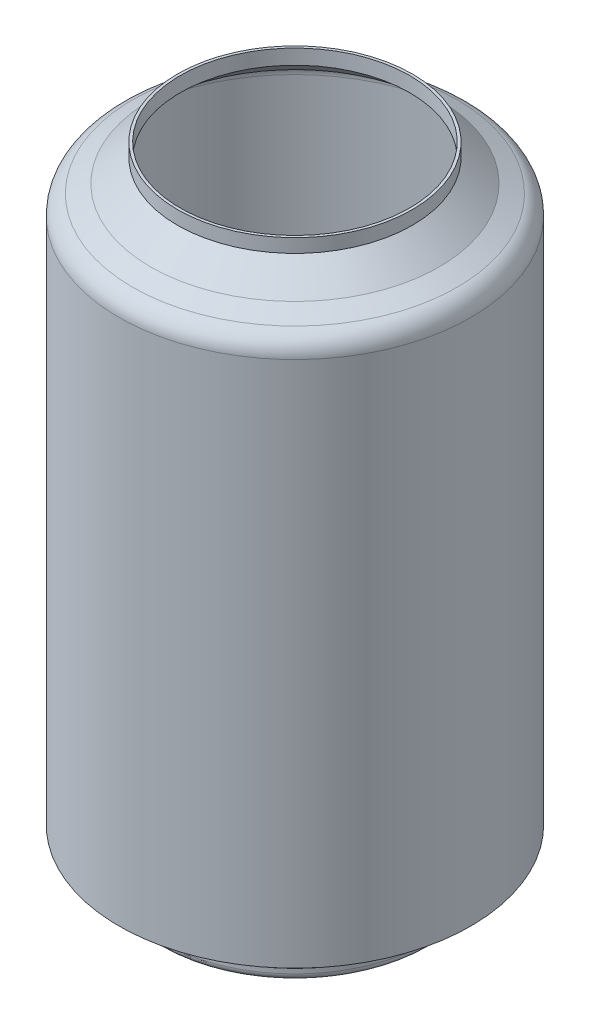
ISO-10303-21;
HEADER;
FILE_DESCRIPTION(('STEP AP214'),'2;1');
FILE_NAME('part.step','',(''),(''),'','','');
FILE_SCHEMA(('AUTOMOTIVE_DESIGN { 1 0 10303 214 1 1 1 1 }'));
ENDSEC;
DATA;
#1=APPLICATION_CONTEXT('core data for automotive mechanical design processes');
#2=APPLICATION_PROTOCOL_DEFINITION('international standard','automotive_design',2000,#1);
#3=PRODUCT_CONTEXT('',#1,'mechanical');
#4=PRODUCT('Part','Part','',(#3));
#5=PRODUCT_RELATED_PRODUCT_CATEGORY('part','',(#4));
#6=PRODUCT_DEFINITION_FORMATION('','',#4);
#7=PRODUCT_DEFINITION_CONTEXT('part definition',#1,'design');
#8=PRODUCT_DEFINITION('design','',#6,#7);
#9=PRODUCT_DEFINITION_SHAPE('','',#8);
#10=(LENGTH_UNIT() NAMED_UNIT(*) SI_UNIT(.MILLI.,.METRE.));
#11=(NAMED_UNIT(*) PLANE_ANGLE_UNIT() SI_UNIT($,.RADIAN.));
#12=(NAMED_UNIT(*) SI_UNIT($,.STERADIAN.) SOLID_ANGLE_UNIT());
#13=UNCERTAINTY_MEASURE_WITH_UNIT(LENGTH_MEASURE(1.E-05),#10,'distance_accuracy_value','');
#14=(GEOMETRIC_REPRESENTATION_CONTEXT(3) GLOBAL_UNCERTAINTY_ASSIGNED_CONTEXT((#13)) GLOBAL_UNIT_ASSIGNED_CONTEXT((#10,
#11,#12)) REPRESENTATION_CONTEXT('',''));
#15=CARTESIAN_POINT('',(0.,0.,0.));
#16=DIRECTION('',(0.,0.,1.));
#17=DIRECTION('',(1.,0.,0.));
#18=AXIS2_PLACEMENT_3D('',#15,#16,#17);
#19=CARTESIAN_POINT('',(0.,1.39999999999999,0.));
#20=DIRECTION('',(0.,-1.,0.));
#21=DIRECTION('',(0.,0.,-1.));
#22=AXIS2_PLACEMENT_3D('',#19,#20,#21);
#23=TOROIDAL_SURFACE('',#22,24.,1.26419739388495);
#24=CARTESIAN_POINT('',(0.,1.39999999999999,0.));
#25=DIRECTION('',(0.,-1.,0.));
#26=DIRECTION('',(0.,0.,-1.));
#27=AXIS2_PLACEMENT_3D('',#24,#25,#26);
#28=CIRCLE('',#27,22.7358026061151);
#29=CARTESIAN_POINT('',(0.,1.39999999999999,-22.7358026061151));
#30=VERTEX_POINT('',#29);
#31=EDGE_CURVE('E11',#30,#30,#28,.T.);
#32=ORIENTED_EDGE('',*,*,#31,.F.);
#33=EDGE_LOOP('',(#32));
#34=FACE_BOUND('',#33,.T.);
#35=CARTESIAN_POINT('',(0.,1.39999999999999,0.));
#36=DIRECTION('',(0.,-1.,0.));
#37=DIRECTION('',(0.,0.,-1.));
#38=AXIS2_PLACEMENT_3D('',#35,#36,#37);
#39=CIRCLE('',#38,25.2641973938849);
#40=CARTESIAN_POINT('',(0.,1.39999999999999,-25.2641973938849));
#41=VERTEX_POINT('',#40);
#42=EDGE_CURVE('E59',#41,#41,#39,.T.);
#43=ORIENTED_EDGE('',*,*,#42,.T.);
#44=EDGE_LOOP('',(#43));
#45=FACE_BOUND('',#44,.T.);
#46=ADVANCED_FACE('F36',(#34,#45),#23,.T.);
#47=CARTESIAN_POINT('',(0.,-47.1531669418886,6.13242959141188));
#48=DIRECTION('',(-1.,0.,0.));
#49=DIRECTION('',(0.,0.,-1.));
#50=AXIS2_PLACEMENT_3D('',#47,#48,#49);
#51=CIRCLE('',#50,56.4870325853397);
#52=TRIMMED_CURVE('',#51,(PARAMETER_VALUE(-1.46201843884181)),
(PARAMETER_VALUE(1.46201843884181)),.T.,.PARAMETER.);
#53=CARTESIAN_POINT('',(0.,-47.1531669418886,0.));
#54=DIRECTION('',(0.,-1.,0.));
#55=AXIS1_PLACEMENT('',#53,#54);
#56=SURFACE_OF_REVOLUTION('',#52,#55);
#57=CARTESIAN_POINT('',(0.,9.,0.));
#58=VERTEX_POINT('',#57);
#59=VERTEX_LOOP('',#58);
#60=FACE_BOUND('',#59,.T.);
#61=ORIENTED_EDGE('',*,*,#31,.T.);
#62=EDGE_LOOP('',(#61));
#63=FACE_BOUND('',#62,.T.);
#64=ADVANCED_FACE('F112',(#60,#63),#56,.F.);
#65=CARTESIAN_POINT('',(-22.038125522927,118.749725239531,0.));
#66=DIRECTION('',(0.,-1.,0.));
#67=DIRECTION('',(0.,0.,-1.));
#68=AXIS2_PLACEMENT_3D('',#65,#66,#67);
#69=PLANE('',#68);
#70=CARTESIAN_POINT('',(0.,118.749725239531,0.));
#71=DIRECTION('',(0.,-1.,0.));
#72=DIRECTION('',(0.,0.,-1.));
#73=AXIS2_PLACEMENT_3D('',#70,#71,#72);
#74=CIRCLE('',#73,21.538125522927);
#75=CARTESIAN_POINT('',(0.,118.749725239531,-21.538125522927));
#76=VERTEX_POINT('',#75);
#77=EDGE_CURVE('E60',#76,#76,#74,.T.);
#78=ORIENTED_EDGE('',*,*,#77,.T.);
#79=EDGE_LOOP('',(#78));
#80=FACE_BOUND('',#79,.T.);
#81=CARTESIAN_POINT('',(0.,118.749725239531,0.));
#82=DIRECTION('',(0.,-1.,0.));
#83=DIRECTION('',(0.,0.,-1.));
#84=AXIS2_PLACEMENT_3D('',#81,#82,#83);
#85=CIRCLE('',#84,22.038125522927);
#86=CARTESIAN_POINT('',(0.,118.749725239531,-22.038125522927));
#87=VERTEX_POINT('',#86);
#88=EDGE_CURVE('E43',#87,#87,#85,.T.);
#89=ORIENTED_EDGE('',*,*,#88,.F.);
#90=EDGE_LOOP('',(#89));
#91=FACE_BOUND('',#90,.T.);
#92=ADVANCED_FACE('F110',(#80,#91),#69,.F.);
#93=CARTESIAN_POINT('',(0.,0.,0.));
#94=DIRECTION('',(0.,-1.,0.));
#95=DIRECTION('',(0.,0.,-1.));
#96=AXIS2_PLACEMENT_3D('',#93,#94,#95);
#97=CYLINDRICAL_SURFACE('',#96,22.038125522927);
#98=CARTESIAN_POINT('',(0.,116.19078652945,0.));
#99=DIRECTION('',(0.,-1.,0.));
#100=DIRECTION('',(0.,0.,-1.));
#101=AXIS2_PLACEMENT_3D('',#98,#99,#100);
#102=CIRCLE('',#101,22.038125522927);
#103=CARTESIAN_POINT('',(0.,116.19078652945,-22.038125522927));
#104=VERTEX_POINT('',#103);
#105=EDGE_CURVE('E103',#104,#104,#102,.T.);
#106=ORIENTED_EDGE('',*,*,#105,.F.);
#107=EDGE_LOOP('',(#106));
#108=FACE_BOUND('',#107,.T.);
#109=ORIENTED_EDGE('',*,*,#88,.T.);
#110=EDGE_LOOP('',(#109));
#111=FACE_BOUND('',#110,.T.);
#112=ADVANCED_FACE('F108',(#108,#111),#97,.T.);
#113=CARTESIAN_POINT('',(0.,116.19078652945,0.));
#114=DIRECTION('',(0.,-1.,0.));
#115=DIRECTION('',(0.,0.,-1.));
#116=AXIS2_PLACEMENT_3D('',#113,#114,#115);
#117=CONICAL_SURFACE('',#116,22.038125522927,0.871796712755894);
#118=CARTESIAN_POINT('',(0.,111.952195064982,0.));
#119=DIRECTION('',(0.,-1.,0.));
#120=DIRECTION('',(0.,0.,-1.));
#121=AXIS2_PLACEMENT_3D('',#118,#119,#120);
#122=CIRCLE('',#121,27.0805877823806);
#123=CARTESIAN_POINT('',(0.,111.952195064982,-27.0805877823806));
#124=VERTEX_POINT('',#123);
#125=EDGE_CURVE('E100',#124,#124,#122,.T.);
#126=ORIENTED_EDGE('',*,*,#125,.F.);
#127=EDGE_LOOP('',(#126));
#128=FACE_BOUND('',#127,.T.);
#129=ORIENTED_EDGE('',*,*,#105,.T.);
#130=EDGE_LOOP('',(#129));
#131=FACE_BOUND('',#130,.T.);
#132=ADVANCED_FACE('F119',(#128,#131),#117,.T.);
#133=CARTESIAN_POINT('',(0.,111.952195064982,0.));
#134=DIRECTION('',(0.,-1.,0.));
#135=DIRECTION('',(0.,0.,-1.));
#136=AXIS2_PLACEMENT_3D('',#133,#134,#135);
#137=CONICAL_SURFACE('',#136,27.0805877823806,1.12687770622536);
#138=CARTESIAN_POINT('',(0.,110.344453475011,0.));
#139=DIRECTION('',(0.,-1.,0.));
#140=DIRECTION('',(0.,0.,-1.));
#141=AXIS2_PLACEMENT_3D('',#138,#139,#140);
#142=CIRCLE('',#141,30.4612037705963);
#143=CARTESIAN_POINT('',(0.,110.344453475011,-30.4612037705963));
#144=VERTEX_POINT('',#143);
#145=EDGE_CURVE('E97',#144,#144,#142,.T.);
#146=ORIENTED_EDGE('',*,*,#145,.F.);
#147=EDGE_LOOP('',(#146));
#148=FACE_BOUND('',#147,.T.);
#149=ORIENTED_EDGE('',*,*,#125,.T.);
#150=EDGE_LOOP('',(#149));
#151=FACE_BOUND('',#150,.T.);
#152=ADVANCED_FACE('F151',(#148,#151),#137,.T.);
#153=CARTESIAN_POINT('',(0.,106.692931867021,0.));
#154=DIRECTION('',(0.,-1.,0.));
#155=DIRECTION('',(0.,0.,-1.));
#156=AXIS2_PLACEMENT_3D('',#153,#154,#155);
#157=TOROIDAL_SURFACE('',#156,29.1046309823966,3.89536901760336);
#158=CARTESIAN_POINT('',(0.,106.692931867021,0.));
#159=DIRECTION('',(0.,-1.,0.));
#160=DIRECTION('',(0.,0.,-1.));
#161=AXIS2_PLACEMENT_3D('',#158,#159,#160);
#162=CIRCLE('',#161,33.);
#163=CARTESIAN_POINT('',(0.,106.692931867021,-33.));
#164=VERTEX_POINT('',#163);
#165=EDGE_CURVE('E94',#164,#164,#162,.T.);
#166=ORIENTED_EDGE('',*,*,#165,.F.);
#167=EDGE_LOOP('',(#166));
#168=FACE_BOUND('',#167,.T.);
#169=ORIENTED_EDGE('',*,*,#145,.T.);
#170=EDGE_LOOP('',(#169));
#171=FACE_BOUND('',#170,.T.);
#172=ADVANCED_FACE('F145',(#168,#171),#157,.T.);
#173=CARTESIAN_POINT('',(0.,0.,0.));
#174=DIRECTION('',(0.,-1.,0.));
#175=DIRECTION('',(0.,0.,-1.));
#176=AXIS2_PLACEMENT_3D('',#173,#174,#175);
#177=CYLINDRICAL_SURFACE('',#176,33.);
#178=CARTESIAN_POINT('',(0.,7.80771185274561,0.));
#179=DIRECTION('',(0.,-1.,0.));
#180=DIRECTION('',(0.,0.,-1.));
#181=AXIS2_PLACEMENT_3D('',#178,#179,#180);
#182=CIRCLE('',#181,33.);
#183=CARTESIAN_POINT('',(0.,7.80771185274561,-33.));
#184=VERTEX_POINT('',#183);
#185=EDGE_CURVE('E91',#184,#184,#182,.T.);
#186=ORIENTED_EDGE('',*,*,#185,.F.);
#187=EDGE_LOOP('',(#186));
#188=FACE_BOUND('',#187,.T.);
#189=ORIENTED_EDGE('',*,*,#165,.T.);
#190=EDGE_LOOP('',(#189));
#191=FACE_BOUND('',#190,.T.);
#192=ADVANCED_FACE('F139',(#188,#191),#177,.T.);
#193=CARTESIAN_POINT('',(0.,7.80771185274561,0.));
#194=DIRECTION('',(0.,1.,0.));
#195=DIRECTION('',(0.,0.,1.));
#196=AXIS2_PLACEMENT_3D('',#193,#194,#195);
#197=CONICAL_SURFACE('',#196,33.,0.952083237375954);
#198=CARTESIAN_POINT('',(0.,2.30006806944518,0.));
#199=DIRECTION('',(0.,-1.,0.));
#200=DIRECTION('',(0.,0.,-1.));
#201=AXIS2_PLACEMENT_3D('',#198,#199,#200);
#202=CIRCLE('',#201,25.2641973938849);
#203=CARTESIAN_POINT('',(0.,2.30006806944518,-25.2641973938849));
#204=VERTEX_POINT('',#203);
#205=EDGE_CURVE('E63',#204,#204,#202,.T.);
#206=ORIENTED_EDGE('',*,*,#205,.F.);
#207=EDGE_LOOP('',(#206));
#208=FACE_BOUND('',#207,.T.);
#209=ORIENTED_EDGE('',*,*,#185,.T.);
#210=EDGE_LOOP('',(#209));
#211=FACE_BOUND('',#210,.T.);
#212=ADVANCED_FACE('F133',(#208,#211),#197,.T.);
#213=CARTESIAN_POINT('',(0.,0.,0.));
#214=DIRECTION('',(0.,-1.,0.));
#215=DIRECTION('',(0.,0.,-1.));
#216=AXIS2_PLACEMENT_3D('',#213,#214,#215);
#217=CYLINDRICAL_SURFACE('',#216,25.2641973938849);
#218=ORIENTED_EDGE('',*,*,#42,.F.);
#219=EDGE_LOOP('',(#218));
#220=FACE_BOUND('',#219,.T.);
#221=ORIENTED_EDGE('',*,*,#205,.T.);
#222=EDGE_LOOP('',(#221));
#223=FACE_BOUND('',#222,.T.);
#224=ADVANCED_FACE('F130',(#220,#223),#217,.T.);
#225=CARTESIAN_POINT('',(0.,1.39999999999999,0.));
#226=DIRECTION('',(0.,-1.,0.));
#227=DIRECTION('',(0.,0.,-1.));
#228=AXIS2_PLACEMENT_3D('',#225,#226,#227);
#229=TOROIDAL_SURFACE('',#228,24.,0.764197393884947);
#230=CARTESIAN_POINT('',(0.,1.65683164383723,0.));
#231=DIRECTION('',(0.,1.,0.));
#232=DIRECTION('',(0.,0.,1.));
#233=AXIS2_PLACEMENT_3D('',#230,#231,#232);
#234=CIRCLE('',#233,23.2802534032423);
#235=CARTESIAN_POINT('',(0.,1.65683164383723,23.2802534032423));
#236=VERTEX_POINT('',#235);
#237=EDGE_CURVE('E57',#236,#236,#234,.F.);
#238=ORIENTED_EDGE('',*,*,#237,.T.);
#239=EDGE_LOOP('',(#238));
#240=FACE_BOUND('',#239,.T.);
#241=CARTESIAN_POINT('',(0.,1.39999999999999,0.));
#242=DIRECTION('',(0.,-1.,0.));
#243=DIRECTION('',(0.,0.,-1.));
#244=AXIS2_PLACEMENT_3D('',#241,#242,#243);
#245=CIRCLE('',#244,24.7641973938849);
#246=CARTESIAN_POINT('',(0.,1.39999999999999,-24.7641973938849));
#247=VERTEX_POINT('',#246);
#248=EDGE_CURVE('E69',#247,#247,#245,.T.);
#249=ORIENTED_EDGE('',*,*,#248,.F.);
#250=EDGE_LOOP('',(#249));
#251=FACE_BOUND('',#250,.T.);
#252=ADVANCED_FACE('F53',(#240,#251),#229,.F.);
#253=CARTESIAN_POINT('',(0.,-47.1531669418886,6.13242959141188));
#254=DIRECTION('',(-1.,0.,0.));
#255=DIRECTION('',(0.,0.,-1.));
#256=AXIS2_PLACEMENT_3D('',#253,#254,#255);
#257=CIRCLE('',#256,56.9870325853397);
#258=TRIMMED_CURVE('',#257,(PARAMETER_VALUE(-1.46297658027829)),
(PARAMETER_VALUE(1.46297658027829)),.T.,.PARAMETER.);
#259=CARTESIAN_POINT('',(0.,-47.1531669418886,0.));
#260=DIRECTION('',(0.,-1.,0.));
#261=AXIS1_PLACEMENT('',#259,#260);
#262=SURFACE_OF_REVOLUTION('',#258,#261);
#263=CARTESIAN_POINT('',(0.,9.50294649866563,0.));
#264=VERTEX_POINT('',#263);
#265=VERTEX_LOOP('',#264);
#266=FACE_BOUND('',#265,.T.);
#267=ORIENTED_EDGE('',*,*,#237,.F.);
#268=EDGE_LOOP('',(#267));
#269=FACE_BOUND('',#268,.T.);
#270=ADVANCED_FACE('F49',(#266,#269),#262,.T.);
#271=CARTESIAN_POINT('',(0.,0.,0.));
#272=DIRECTION('',(0.,-1.,0.));
#273=DIRECTION('',(0.,0.,-1.));
#274=AXIS2_PLACEMENT_3D('',#271,#272,#273);
#275=CYLINDRICAL_SURFACE('',#274,21.538125522927);
#276=CARTESIAN_POINT('',(0.,115.957896805634,0.));
#277=DIRECTION('',(0.,-1.,0.));
#278=DIRECTION('',(0.,0.,-1.));
#279=AXIS2_PLACEMENT_3D('',#276,#277,#278);
#280=CIRCLE('',#279,21.538125522927);
#281=CARTESIAN_POINT('',(0.,115.957896805634,-21.538125522927));
#282=VERTEX_POINT('',#281);
#283=EDGE_CURVE('E66',#282,#282,#280,.T.);
#284=ORIENTED_EDGE('',*,*,#283,.T.);
#285=EDGE_LOOP('',(#284));
#286=FACE_BOUND('',#285,.T.);
#287=ORIENTED_EDGE('',*,*,#77,.F.);
#288=EDGE_LOOP('',(#287));
#289=FACE_BOUND('',#288,.T.);
#290=ADVANCED_FACE('F52',(#286,#289),#275,.F.);
#291=CARTESIAN_POINT('',(0.,115.808043394055,0.));
#292=DIRECTION('',(0.,-1.,0.));
#293=DIRECTION('',(0.,0.,-1.));
#294=AXIS2_PLACEMENT_3D('',#291,#292,#293);
#295=CONICAL_SURFACE('',#294,21.7163994091164,0.871796712755894);
#296=CARTESIAN_POINT('',(0.,111.528194874544,0.));
#297=DIRECTION('',(0.,-1.,0.));
#298=DIRECTION('',(0.,0.,-1.));
#299=AXIS2_PLACEMENT_3D('',#296,#297,#298);
#300=CIRCLE('',#299,26.8079433375002);
#301=CARTESIAN_POINT('',(0.,111.528194874544,-26.8079433375002));
#302=VERTEX_POINT('',#301);
#303=EDGE_CURVE('E84',#302,#302,#300,.T.);
#304=ORIENTED_EDGE('',*,*,#303,.T.);
#305=EDGE_LOOP('',(#304));
#306=FACE_BOUND('',#305,.T.);
#307=ORIENTED_EDGE('',*,*,#283,.F.);
#308=EDGE_LOOP('',(#307));
#309=FACE_BOUND('',#308,.T.);
#310=ADVANCED_FACE('F186',(#306,#309),#295,.F.);
#311=CARTESIAN_POINT('',(0.,111.500657252054,0.));
#312=DIRECTION('',(0.,-1.,0.));
#313=DIRECTION('',(0.,0.,-1.));
#314=AXIS2_PLACEMENT_3D('',#311,#312,#313);
#315=CONICAL_SURFACE('',#314,26.865847000281,1.12687770622536);
#316=CARTESIAN_POINT('',(0.,109.883112096233,0.));
#317=DIRECTION('',(0.,-1.,0.));
#318=DIRECTION('',(0.,0.,-1.));
#319=AXIS2_PLACEMENT_3D('',#316,#317,#318);
#320=CIRCLE('',#319,30.2670770546277);
#321=CARTESIAN_POINT('',(0.,109.883112096233,-30.2670770546277));
#322=VERTEX_POINT('',#321);
#323=EDGE_CURVE('E81',#322,#322,#320,.T.);
#324=ORIENTED_EDGE('',*,*,#323,.T.);
#325=EDGE_LOOP('',(#324));
#326=FACE_BOUND('',#325,.T.);
#327=ORIENTED_EDGE('',*,*,#303,.F.);
#328=EDGE_LOOP('',(#327));
#329=FACE_BOUND('',#328,.T.);
#330=ADVANCED_FACE('F182',(#326,#329),#315,.F.);
#331=CARTESIAN_POINT('',(0.,106.692931867021,0.));
#332=DIRECTION('',(0.,-1.,0.));
#333=DIRECTION('',(0.,0.,-1.));
#334=AXIS2_PLACEMENT_3D('',#331,#332,#333);
#335=TOROIDAL_SURFACE('',#334,29.1046309823966,3.39536901760336);
#336=CARTESIAN_POINT('',(0.,106.692931867021,0.));
#337=DIRECTION('',(0.,-1.,0.));
#338=DIRECTION('',(0.,0.,-1.));
#339=AXIS2_PLACEMENT_3D('',#336,#337,#338);
#340=CIRCLE('',#339,32.5);
#341=CARTESIAN_POINT('',(0.,106.692931867021,-32.5));
#342=VERTEX_POINT('',#341);
#343=EDGE_CURVE('E78',#342,#342,#340,.T.);
#344=ORIENTED_EDGE('',*,*,#343,.T.);
#345=EDGE_LOOP('',(#344));
#346=FACE_BOUND('',#345,.T.);
#347=ORIENTED_EDGE('',*,*,#323,.F.);
#348=EDGE_LOOP('',(#347));
#349=FACE_BOUND('',#348,.T.);
#350=ADVANCED_FACE('F178',(#346,#349),#335,.F.);
#351=CARTESIAN_POINT('',(0.,0.,0.));
#352=DIRECTION('',(0.,-1.,0.));
#353=DIRECTION('',(0.,0.,-1.));
#354=AXIS2_PLACEMENT_3D('',#351,#352,#353);
#355=CYLINDRICAL_SURFACE('',#354,32.5);
#356=CARTESIAN_POINT('',(0.,8.06550681334457,0.));
#357=DIRECTION('',(0.,1.,0.));
#358=DIRECTION('',(0.,0.,1.));
#359=AXIS2_PLACEMENT_3D('',#356,#357,#358);
#360=CIRCLE('',#359,32.5);
#361=CARTESIAN_POINT('',(0.,8.06550681334457,32.5));
#362=VERTEX_POINT('',#361);
#363=EDGE_CURVE('E75',#362,#362,#360,.F.);
#364=ORIENTED_EDGE('',*,*,#363,.T.);
#365=EDGE_LOOP('',(#364));
#366=FACE_BOUND('',#365,.T.);
#367=ORIENTED_EDGE('',*,*,#343,.F.);
#368=EDGE_LOOP('',(#367));
#369=FACE_BOUND('',#368,.T.);
#370=ADVANCED_FACE('F174',(#366,#369),#355,.F.);
#371=CARTESIAN_POINT('',(0.,8.21502461414783,0.));
#372=DIRECTION('',(0.,1.,0.));
#373=DIRECTION('',(0.,0.,1.));
#374=AXIS2_PLACEMENT_3D('',#371,#372,#373);
#375=CONICAL_SURFACE('',#374,32.7100063545543,0.952083237375954);
#376=CARTESIAN_POINT('',(0.,2.55786303004414,0.));
#377=DIRECTION('',(0.,1.,0.));
#378=DIRECTION('',(0.,0.,1.));
#379=AXIS2_PLACEMENT_3D('',#376,#377,#378);
#380=CIRCLE('',#379,24.7641973938849);
#381=CARTESIAN_POINT('',(0.,2.55786303004414,24.7641973938849));
#382=VERTEX_POINT('',#381);
#383=EDGE_CURVE('E72',#382,#382,#380,.F.);
#384=ORIENTED_EDGE('',*,*,#383,.T.);
#385=EDGE_LOOP('',(#384));
#386=FACE_BOUND('',#385,.T.);
#387=ORIENTED_EDGE('',*,*,#363,.F.);
#388=EDGE_LOOP('',(#387));
#389=FACE_BOUND('',#388,.T.);
#390=ADVANCED_FACE('F170',(#386,#389),#375,.F.);
#391=CARTESIAN_POINT('',(0.,0.,0.));
#392=DIRECTION('',(0.,-1.,0.));
#393=DIRECTION('',(0.,0.,-1.));
#394=AXIS2_PLACEMENT_3D('',#391,#392,#393);
#395=CYLINDRICAL_SURFACE('',#394,24.7641973938849);
#396=ORIENTED_EDGE('',*,*,#248,.T.);
#397=EDGE_LOOP('',(#396));
#398=FACE_BOUND('',#397,.T.);
#399=ORIENTED_EDGE('',*,*,#383,.F.);
#400=EDGE_LOOP('',(#399));
#401=FACE_BOUND('',#400,.T.);
#402=ADVANCED_FACE('F167',(#398,#401),#395,.F.);
#403=CLOSED_SHELL('',(#46,#64,#92,#112,#132,#152,#172,#192,#212,#224,#252,#270,#290,#310,#330,
#350,#370,#390,#402));
#404=MANIFOLD_SOLID_BREP('B2',#403);
#405=ADVANCED_BREP_SHAPE_REPRESENTATION('',(#18,#404),#14);
#406=SHAPE_DEFINITION_REPRESENTATION(#9,#405);
ENDSEC;
END-ISO-10303-21;
